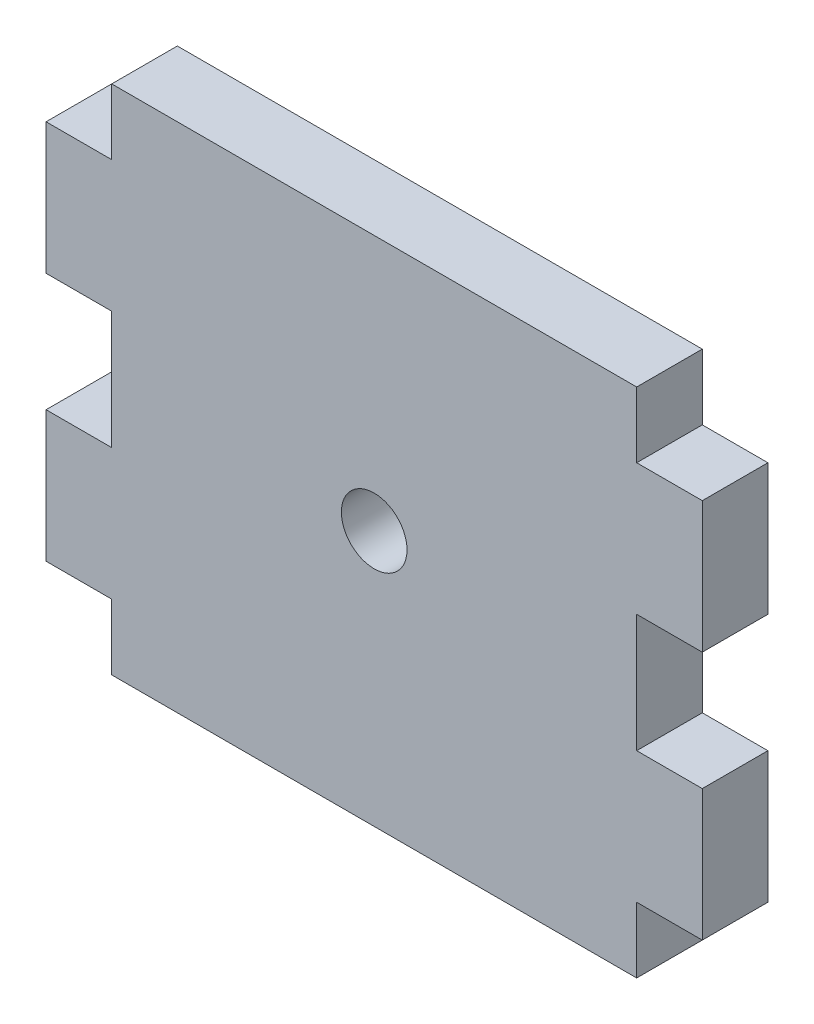
ISO-10303-21;
HEADER;
FILE_DESCRIPTION(('STEP AP214'),'2;1');
FILE_NAME('part.step','',(''),(''),'','','');
FILE_SCHEMA(('AUTOMOTIVE_DESIGN { 1 0 10303 214 1 1 1 1 }'));
ENDSEC;
DATA;
#1=APPLICATION_CONTEXT('core data for automotive mechanical design processes');
#2=APPLICATION_PROTOCOL_DEFINITION('international standard','automotive_design',2000,#1);
#3=PRODUCT_CONTEXT('',#1,'mechanical');
#4=PRODUCT('Part','Part','',(#3));
#5=PRODUCT_RELATED_PRODUCT_CATEGORY('part','',(#4));
#6=PRODUCT_DEFINITION_FORMATION('','',#4);
#7=PRODUCT_DEFINITION_CONTEXT('part definition',#1,'design');
#8=PRODUCT_DEFINITION('design','',#6,#7);
#9=PRODUCT_DEFINITION_SHAPE('','',#8);
#10=(LENGTH_UNIT() NAMED_UNIT(*) SI_UNIT(.MILLI.,.METRE.));
#11=(NAMED_UNIT(*) PLANE_ANGLE_UNIT() SI_UNIT($,.RADIAN.));
#12=(NAMED_UNIT(*) SI_UNIT($,.STERADIAN.) SOLID_ANGLE_UNIT());
#13=UNCERTAINTY_MEASURE_WITH_UNIT(LENGTH_MEASURE(1.E-05),#10,'distance_accuracy_value','');
#14=(GEOMETRIC_REPRESENTATION_CONTEXT(3) GLOBAL_UNCERTAINTY_ASSIGNED_CONTEXT((#13)) GLOBAL_UNIT_ASSIGNED_CONTEXT((#10,
#11,#12)) REPRESENTATION_CONTEXT('',''));
#15=CARTESIAN_POINT('',(0.,0.,0.));
#16=DIRECTION('',(0.,0.,1.));
#17=DIRECTION('',(1.,0.,0.));
#18=AXIS2_PLACEMENT_3D('',#15,#16,#17);
#19=CARTESIAN_POINT('',(0.,0.,5.));
#20=DIRECTION('',(0.,0.,1.));
#21=DIRECTION('',(1.,0.,0.));
#22=AXIS2_PLACEMENT_3D('',#19,#20,#21);
#23=PLANE('',#22);
#24=DIRECTION('',(0.,1.,0.));
#25=VECTOR('',#24,1.);
#26=CARTESIAN_POINT('',(25.,4.5,5.));
#27=LINE('',#26,#25);
#28=CARTESIAN_POINT('',(25.,4.5,5.));
#29=VERTEX_POINT('',#28);
#30=CARTESIAN_POINT('',(25.,14.5,5.));
#31=VERTEX_POINT('',#30);
#32=EDGE_CURVE('E241',#29,#31,#27,.T.);
#33=ORIENTED_EDGE('',*,*,#32,.T.);
#34=DIRECTION('',(-1.,0.,0.));
#35=VECTOR('',#34,1.);
#36=CARTESIAN_POINT('',(25.,14.5,5.));
#37=LINE('',#36,#35);
#38=CARTESIAN_POINT('',(20.,14.5,5.));
#39=VERTEX_POINT('',#38);
#40=EDGE_CURVE('E129',#31,#39,#37,.T.);
#41=ORIENTED_EDGE('',*,*,#40,.T.);
#42=DIRECTION('',(0.,1.,0.));
#43=VECTOR('',#42,1.);
#44=CARTESIAN_POINT('',(20.,14.5,5.));
#45=LINE('',#44,#43);
#46=CARTESIAN_POINT('',(20.,19.5,5.));
#47=VERTEX_POINT('',#46);
#48=EDGE_CURVE('E292',#39,#47,#45,.T.);
#49=ORIENTED_EDGE('',*,*,#48,.T.);
#50=DIRECTION('',(-1.,0.,0.));
#51=VECTOR('',#50,1.);
#52=CARTESIAN_POINT('',(-20.,19.5,5.));
#53=LINE('',#52,#51);
#54=CARTESIAN_POINT('',(-20.,19.5,5.));
#55=VERTEX_POINT('',#54);
#56=EDGE_CURVE('E311',#47,#55,#53,.T.);
#57=ORIENTED_EDGE('',*,*,#56,.T.);
#58=DIRECTION('',(0.,-1.,0.));
#59=VECTOR('',#58,1.);
#60=CARTESIAN_POINT('',(-20.,14.5,5.));
#61=LINE('',#60,#59);
#62=CARTESIAN_POINT('',(-20.,14.5,5.));
#63=VERTEX_POINT('',#62);
#64=EDGE_CURVE('E308',#55,#63,#61,.T.);
#65=ORIENTED_EDGE('',*,*,#64,.T.);
#66=DIRECTION('',(-1.,0.,0.));
#67=VECTOR('',#66,1.);
#68=CARTESIAN_POINT('',(-25.,14.5,5.));
#69=LINE('',#68,#67);
#70=CARTESIAN_POINT('',(-25.,14.5,5.));
#71=VERTEX_POINT('',#70);
#72=EDGE_CURVE('E310',#63,#71,#69,.T.);
#73=ORIENTED_EDGE('',*,*,#72,.T.);
#74=DIRECTION('',(0.,-1.,0.));
#75=VECTOR('',#74,1.);
#76=CARTESIAN_POINT('',(-25.,4.5,5.));
#77=LINE('',#76,#75);
#78=CARTESIAN_POINT('',(-25.,4.5,5.));
#79=VERTEX_POINT('',#78);
#80=EDGE_CURVE('E313',#71,#79,#77,.T.);
#81=ORIENTED_EDGE('',*,*,#80,.T.);
#82=DIRECTION('',(1.,0.,0.));
#83=VECTOR('',#82,1.);
#84=CARTESIAN_POINT('',(-20.,4.5,5.));
#85=LINE('',#84,#83);
#86=CARTESIAN_POINT('',(-20.,4.5,5.));
#87=VERTEX_POINT('',#86);
#88=EDGE_CURVE('E319',#79,#87,#85,.T.);
#89=ORIENTED_EDGE('',*,*,#88,.T.);
#90=DIRECTION('',(0.,-1.,0.));
#91=VECTOR('',#90,1.);
#92=CARTESIAN_POINT('',(-20.,4.5,5.));
#93=LINE('',#92,#91);
#94=CARTESIAN_POINT('',(-20.,-4.5,5.));
#95=VERTEX_POINT('',#94);
#96=EDGE_CURVE('E321',#87,#95,#93,.T.);
#97=ORIENTED_EDGE('',*,*,#96,.T.);
#98=DIRECTION('',(-1.,0.,0.));
#99=VECTOR('',#98,1.);
#100=CARTESIAN_POINT('',(-20.,-4.5,5.));
#101=LINE('',#100,#99);
#102=CARTESIAN_POINT('',(-25.,-4.5,5.));
#103=VERTEX_POINT('',#102);
#104=EDGE_CURVE('E323',#95,#103,#101,.T.);
#105=ORIENTED_EDGE('',*,*,#104,.T.);
#106=DIRECTION('',(0.,-1.,0.));
#107=VECTOR('',#106,1.);
#108=CARTESIAN_POINT('',(-25.,-14.5,5.));
#109=LINE('',#108,#107);
#110=CARTESIAN_POINT('',(-25.,-14.5,5.));
#111=VERTEX_POINT('',#110);
#112=EDGE_CURVE('E325',#103,#111,#109,.T.);
#113=ORIENTED_EDGE('',*,*,#112,.T.);
#114=DIRECTION('',(1.,0.,0.));
#115=VECTOR('',#114,1.);
#116=CARTESIAN_POINT('',(-25.,-14.5,5.));
#117=LINE('',#116,#115);
#118=CARTESIAN_POINT('',(-20.,-14.5,5.));
#119=VERTEX_POINT('',#118);
#120=EDGE_CURVE('E327',#111,#119,#117,.T.);
#121=ORIENTED_EDGE('',*,*,#120,.T.);
#122=DIRECTION('',(0.,-1.,0.));
#123=VECTOR('',#122,1.);
#124=CARTESIAN_POINT('',(-20.,-14.5,5.));
#125=LINE('',#124,#123);
#126=CARTESIAN_POINT('',(-20.,-19.5,5.));
#127=VERTEX_POINT('',#126);
#128=EDGE_CURVE('E329',#119,#127,#125,.T.);
#129=ORIENTED_EDGE('',*,*,#128,.T.);
#130=DIRECTION('',(1.,0.,0.));
#131=VECTOR('',#130,1.);
#132=CARTESIAN_POINT('',(-20.,-19.5,5.));
#133=LINE('',#132,#131);
#134=CARTESIAN_POINT('',(20.,-19.5,5.));
#135=VERTEX_POINT('',#134);
#136=EDGE_CURVE('E331',#127,#135,#133,.T.);
#137=ORIENTED_EDGE('',*,*,#136,.T.);
#138=DIRECTION('',(0.,1.,0.));
#139=VECTOR('',#138,1.);
#140=CARTESIAN_POINT('',(20.,-14.5,5.));
#141=LINE('',#140,#139);
#142=CARTESIAN_POINT('',(20.,-14.5,5.));
#143=VERTEX_POINT('',#142);
#144=EDGE_CURVE('E333',#135,#143,#141,.T.);
#145=ORIENTED_EDGE('',*,*,#144,.T.);
#146=DIRECTION('',(1.,0.,0.));
#147=VECTOR('',#146,1.);
#148=CARTESIAN_POINT('',(20.,-14.5,5.));
#149=LINE('',#148,#147);
#150=CARTESIAN_POINT('',(25.,-14.5,5.));
#151=VERTEX_POINT('',#150);
#152=EDGE_CURVE('E335',#143,#151,#149,.T.);
#153=ORIENTED_EDGE('',*,*,#152,.T.);
#154=DIRECTION('',(0.,1.,0.));
#155=VECTOR('',#154,1.);
#156=CARTESIAN_POINT('',(25.,-14.5,5.));
#157=LINE('',#156,#155);
#158=CARTESIAN_POINT('',(25.,-4.5,5.));
#159=VERTEX_POINT('',#158);
#160=EDGE_CURVE('E184',#151,#159,#157,.T.);
#161=ORIENTED_EDGE('',*,*,#160,.T.);
#162=DIRECTION('',(-1.,0.,0.));
#163=VECTOR('',#162,1.);
#164=CARTESIAN_POINT('',(25.,-4.5,5.));
#165=LINE('',#164,#163);
#166=CARTESIAN_POINT('',(20.,-4.5,5.));
#167=VERTEX_POINT('',#166);
#168=EDGE_CURVE('E178',#159,#167,#165,.T.);
#169=ORIENTED_EDGE('',*,*,#168,.T.);
#170=DIRECTION('',(0.,1.,0.));
#171=VECTOR('',#170,1.);
#172=CARTESIAN_POINT('',(20.,4.5,5.));
#173=LINE('',#172,#171);
#174=CARTESIAN_POINT('',(20.,4.5,5.));
#175=VERTEX_POINT('',#174);
#176=EDGE_CURVE('E182',#167,#175,#173,.T.);
#177=ORIENTED_EDGE('',*,*,#176,.T.);
#178=DIRECTION('',(1.,0.,0.));
#179=VECTOR('',#178,1.);
#180=CARTESIAN_POINT('',(20.,4.5,5.));
#181=LINE('',#180,#179);
#182=EDGE_CURVE('E50',#175,#29,#181,.T.);
#183=ORIENTED_EDGE('',*,*,#182,.T.);
#184=EDGE_LOOP('',(#33,#41,#49,#57,#65,#73,#81,#89,#97,#105,#113,#121,#129,#137,#145,#153,#161,
#169,#177,#183));
#185=FACE_BOUND('',#184,.T.);
#186=CARTESIAN_POINT('',(0.,0.,5.));
#187=DIRECTION('',(0.,0.,1.));
#188=DIRECTION('',(1.,0.,0.));
#189=AXIS2_PLACEMENT_3D('',#186,#187,#188);
#190=CIRCLE('',#189,2.5);
#191=CARTESIAN_POINT('',(2.5,0.,5.));
#192=VERTEX_POINT('',#191);
#193=EDGE_CURVE('E206',#192,#192,#190,.T.);
#194=ORIENTED_EDGE('',*,*,#193,.F.);
#195=EDGE_LOOP('',(#194));
#196=FACE_BOUND('',#195,.T.);
#197=ADVANCED_FACE('F33',(#185,#196),#23,.T.);
#198=CARTESIAN_POINT('',(0.,0.,0.));
#199=DIRECTION('',(0.,0.,1.));
#200=DIRECTION('',(1.,0.,0.));
#201=AXIS2_PLACEMENT_3D('',#198,#199,#200);
#202=PLANE('',#201);
#203=DIRECTION('',(0.,1.,0.));
#204=VECTOR('',#203,1.);
#205=CARTESIAN_POINT('',(25.,4.5,0.));
#206=LINE('',#205,#204);
#207=CARTESIAN_POINT('',(25.,4.5,0.));
#208=VERTEX_POINT('',#207);
#209=CARTESIAN_POINT('',(25.,14.5,0.));
#210=VERTEX_POINT('',#209);
#211=EDGE_CURVE('E202',#208,#210,#206,.T.);
#212=ORIENTED_EDGE('',*,*,#211,.F.);
#213=DIRECTION('',(1.,0.,0.));
#214=VECTOR('',#213,1.);
#215=CARTESIAN_POINT('',(20.,4.5,0.));
#216=LINE('',#215,#214);
#217=CARTESIAN_POINT('',(20.,4.5,0.));
#218=VERTEX_POINT('',#217);
#219=EDGE_CURVE('E121',#218,#208,#216,.T.);
#220=ORIENTED_EDGE('',*,*,#219,.F.);
#221=DIRECTION('',(0.,1.,0.));
#222=VECTOR('',#221,1.);
#223=CARTESIAN_POINT('',(20.,4.5,0.));
#224=LINE('',#223,#222);
#225=CARTESIAN_POINT('',(20.,-4.5,0.));
#226=VERTEX_POINT('',#225);
#227=EDGE_CURVE('E115',#226,#218,#224,.T.);
#228=ORIENTED_EDGE('',*,*,#227,.F.);
#229=DIRECTION('',(-1.,0.,0.));
#230=VECTOR('',#229,1.);
#231=CARTESIAN_POINT('',(25.,-4.5,0.));
#232=LINE('',#231,#230);
#233=CARTESIAN_POINT('',(25.,-4.5,0.));
#234=VERTEX_POINT('',#233);
#235=EDGE_CURVE('E192',#234,#226,#232,.T.);
#236=ORIENTED_EDGE('',*,*,#235,.F.);
#237=DIRECTION('',(0.,1.,0.));
#238=VECTOR('',#237,1.);
#239=CARTESIAN_POINT('',(25.,-14.5,0.));
#240=LINE('',#239,#238);
#241=CARTESIAN_POINT('',(25.,-14.5,0.));
#242=VERTEX_POINT('',#241);
#243=EDGE_CURVE('E236',#242,#234,#240,.T.);
#244=ORIENTED_EDGE('',*,*,#243,.F.);
#245=DIRECTION('',(1.,0.,0.));
#246=VECTOR('',#245,1.);
#247=CARTESIAN_POINT('',(20.,-14.5,0.));
#248=LINE('',#247,#246);
#249=CARTESIAN_POINT('',(20.,-14.5,0.));
#250=VERTEX_POINT('',#249);
#251=EDGE_CURVE('E234',#250,#242,#248,.T.);
#252=ORIENTED_EDGE('',*,*,#251,.F.);
#253=DIRECTION('',(0.,1.,0.));
#254=VECTOR('',#253,1.);
#255=CARTESIAN_POINT('',(20.,-14.5,0.));
#256=LINE('',#255,#254);
#257=CARTESIAN_POINT('',(20.,-19.5,0.));
#258=VERTEX_POINT('',#257);
#259=EDGE_CURVE('E232',#258,#250,#256,.T.);
#260=ORIENTED_EDGE('',*,*,#259,.F.);
#261=DIRECTION('',(1.,0.,0.));
#262=VECTOR('',#261,1.);
#263=CARTESIAN_POINT('',(-20.,-19.5,0.));
#264=LINE('',#263,#262);
#265=CARTESIAN_POINT('',(-20.,-19.5,0.));
#266=VERTEX_POINT('',#265);
#267=EDGE_CURVE('E230',#266,#258,#264,.T.);
#268=ORIENTED_EDGE('',*,*,#267,.F.);
#269=DIRECTION('',(0.,-1.,0.));
#270=VECTOR('',#269,1.);
#271=CARTESIAN_POINT('',(-20.,-14.5,0.));
#272=LINE('',#271,#270);
#273=CARTESIAN_POINT('',(-20.,-14.5,0.));
#274=VERTEX_POINT('',#273);
#275=EDGE_CURVE('E228',#274,#266,#272,.T.);
#276=ORIENTED_EDGE('',*,*,#275,.F.);
#277=DIRECTION('',(1.,0.,0.));
#278=VECTOR('',#277,1.);
#279=CARTESIAN_POINT('',(-25.,-14.5,0.));
#280=LINE('',#279,#278);
#281=CARTESIAN_POINT('',(-25.,-14.5,0.));
#282=VERTEX_POINT('',#281);
#283=EDGE_CURVE('E226',#282,#274,#280,.T.);
#284=ORIENTED_EDGE('',*,*,#283,.F.);
#285=DIRECTION('',(0.,-1.,0.));
#286=VECTOR('',#285,1.);
#287=CARTESIAN_POINT('',(-25.,-14.5,0.));
#288=LINE('',#287,#286);
#289=CARTESIAN_POINT('',(-25.,-4.5,0.));
#290=VERTEX_POINT('',#289);
#291=EDGE_CURVE('E224',#290,#282,#288,.T.);
#292=ORIENTED_EDGE('',*,*,#291,.F.);
#293=DIRECTION('',(-1.,0.,0.));
#294=VECTOR('',#293,1.);
#295=CARTESIAN_POINT('',(-20.,-4.5,0.));
#296=LINE('',#295,#294);
#297=CARTESIAN_POINT('',(-20.,-4.5,0.));
#298=VERTEX_POINT('',#297);
#299=EDGE_CURVE('E222',#298,#290,#296,.T.);
#300=ORIENTED_EDGE('',*,*,#299,.F.);
#301=DIRECTION('',(0.,-1.,0.));
#302=VECTOR('',#301,1.);
#303=CARTESIAN_POINT('',(-20.,4.5,0.));
#304=LINE('',#303,#302);
#305=CARTESIAN_POINT('',(-20.,4.5,0.));
#306=VERTEX_POINT('',#305);
#307=EDGE_CURVE('E220',#306,#298,#304,.T.);
#308=ORIENTED_EDGE('',*,*,#307,.F.);
#309=DIRECTION('',(1.,0.,0.));
#310=VECTOR('',#309,1.);
#311=CARTESIAN_POINT('',(-20.,4.5,0.));
#312=LINE('',#311,#310);
#313=CARTESIAN_POINT('',(-25.,4.5,0.));
#314=VERTEX_POINT('',#313);
#315=EDGE_CURVE('E218',#314,#306,#312,.T.);
#316=ORIENTED_EDGE('',*,*,#315,.F.);
#317=DIRECTION('',(0.,-1.,0.));
#318=VECTOR('',#317,1.);
#319=CARTESIAN_POINT('',(-25.,4.5,0.));
#320=LINE('',#319,#318);
#321=CARTESIAN_POINT('',(-25.,14.5,0.));
#322=VERTEX_POINT('',#321);
#323=EDGE_CURVE('E216',#322,#314,#320,.T.);
#324=ORIENTED_EDGE('',*,*,#323,.F.);
#325=DIRECTION('',(-1.,0.,0.));
#326=VECTOR('',#325,1.);
#327=CARTESIAN_POINT('',(-25.,14.5,0.));
#328=LINE('',#327,#326);
#329=CARTESIAN_POINT('',(-20.,14.5,0.));
#330=VERTEX_POINT('',#329);
#331=EDGE_CURVE('E214',#330,#322,#328,.T.);
#332=ORIENTED_EDGE('',*,*,#331,.F.);
#333=DIRECTION('',(0.,-1.,0.));
#334=VECTOR('',#333,1.);
#335=CARTESIAN_POINT('',(-20.,14.5,0.));
#336=LINE('',#335,#334);
#337=CARTESIAN_POINT('',(-20.,19.5,0.));
#338=VERTEX_POINT('',#337);
#339=EDGE_CURVE('E212',#338,#330,#336,.T.);
#340=ORIENTED_EDGE('',*,*,#339,.F.);
#341=DIRECTION('',(-1.,0.,0.));
#342=VECTOR('',#341,1.);
#343=CARTESIAN_POINT('',(-20.,19.5,0.));
#344=LINE('',#343,#342);
#345=CARTESIAN_POINT('',(20.,19.5,0.));
#346=VERTEX_POINT('',#345);
#347=EDGE_CURVE('E210',#346,#338,#344,.T.);
#348=ORIENTED_EDGE('',*,*,#347,.F.);
#349=DIRECTION('',(0.,1.,0.));
#350=VECTOR('',#349,1.);
#351=CARTESIAN_POINT('',(20.,14.5,0.));
#352=LINE('',#351,#350);
#353=CARTESIAN_POINT('',(20.,14.5,0.));
#354=VERTEX_POINT('',#353);
#355=EDGE_CURVE('E208',#354,#346,#352,.T.);
#356=ORIENTED_EDGE('',*,*,#355,.F.);
#357=DIRECTION('',(-1.,0.,0.));
#358=VECTOR('',#357,1.);
#359=CARTESIAN_POINT('',(25.,14.5,0.));
#360=LINE('',#359,#358);
#361=EDGE_CURVE('E205',#210,#354,#360,.T.);
#362=ORIENTED_EDGE('',*,*,#361,.F.);
#363=EDGE_LOOP('',(#212,#220,#228,#236,#244,#252,#260,#268,#276,#284,#292,#300,#308,#316,#324,
#332,#340,#348,#356,#362));
#364=FACE_BOUND('',#363,.T.);
#365=CARTESIAN_POINT('',(0.,0.,0.));
#366=DIRECTION('',(0.,0.,1.));
#367=DIRECTION('',(1.,0.,0.));
#368=AXIS2_PLACEMENT_3D('',#365,#366,#367);
#369=CIRCLE('',#368,2.5);
#370=CARTESIAN_POINT('',(2.5,0.,0.));
#371=VERTEX_POINT('',#370);
#372=EDGE_CURVE('E586',#371,#371,#369,.T.);
#373=ORIENTED_EDGE('',*,*,#372,.T.);
#374=EDGE_LOOP('',(#373));
#375=FACE_BOUND('',#374,.T.);
#376=ADVANCED_FACE('F296',(#364,#375),#202,.F.);
#377=CARTESIAN_POINT('',(25.,4.5,5.));
#378=DIRECTION('',(-1.,0.,0.));
#379=DIRECTION('',(0.,0.,1.));
#380=AXIS2_PLACEMENT_3D('',#377,#378,#379);
#381=PLANE('',#380);
#382=ORIENTED_EDGE('',*,*,#211,.T.);
#383=DIRECTION('',(0.,0.,-1.));
#384=VECTOR('',#383,1.);
#385=CARTESIAN_POINT('',(25.,14.5,5.));
#386=LINE('',#385,#384);
#387=EDGE_CURVE('E11',#31,#210,#386,.T.);
#388=ORIENTED_EDGE('',*,*,#387,.F.);
#389=ORIENTED_EDGE('',*,*,#32,.F.);
#390=DIRECTION('',(0.,0.,-1.));
#391=VECTOR('',#390,1.);
#392=CARTESIAN_POINT('',(25.,4.5,5.));
#393=LINE('',#392,#391);
#394=EDGE_CURVE('E198',#29,#208,#393,.T.);
#395=ORIENTED_EDGE('',*,*,#394,.T.);
#396=EDGE_LOOP('',(#382,#388,#389,#395));
#397=FACE_BOUND('',#396,.T.);
#398=ADVANCED_FACE('F35',(#397),#381,.F.);
#399=CARTESIAN_POINT('',(25.,14.5,5.));
#400=DIRECTION('',(0.,-1.,0.));
#401=DIRECTION('',(0.,0.,-1.));
#402=AXIS2_PLACEMENT_3D('',#399,#400,#401);
#403=PLANE('',#402);
#404=ORIENTED_EDGE('',*,*,#361,.T.);
#405=DIRECTION('',(0.,0.,-1.));
#406=VECTOR('',#405,1.);
#407=CARTESIAN_POINT('',(20.,14.5,5.));
#408=LINE('',#407,#406);
#409=EDGE_CURVE('E42',#39,#354,#408,.T.);
#410=ORIENTED_EDGE('',*,*,#409,.F.);
#411=ORIENTED_EDGE('',*,*,#40,.F.);
#412=ORIENTED_EDGE('',*,*,#387,.T.);
#413=EDGE_LOOP('',(#404,#410,#411,#412));
#414=FACE_BOUND('',#413,.T.);
#415=ADVANCED_FACE('F369',(#414),#403,.F.);
#416=CARTESIAN_POINT('',(20.,14.5,5.));
#417=DIRECTION('',(-1.,0.,0.));
#418=DIRECTION('',(0.,-1.,0.));
#419=AXIS2_PLACEMENT_3D('',#416,#417,#418);
#420=PLANE('',#419);
#421=ORIENTED_EDGE('',*,*,#355,.T.);
#422=DIRECTION('',(0.,0.,-1.));
#423=VECTOR('',#422,1.);
#424=CARTESIAN_POINT('',(20.,19.5,5.));
#425=LINE('',#424,#423);
#426=EDGE_CURVE('E284',#47,#346,#425,.T.);
#427=ORIENTED_EDGE('',*,*,#426,.F.);
#428=ORIENTED_EDGE('',*,*,#48,.F.);
#429=ORIENTED_EDGE('',*,*,#409,.T.);
#430=EDGE_LOOP('',(#421,#427,#428,#429));
#431=FACE_BOUND('',#430,.T.);
#432=ADVANCED_FACE('F290',(#431),#420,.F.);
#433=CARTESIAN_POINT('',(-20.,19.5,5.));
#434=DIRECTION('',(0.,-1.,0.));
#435=DIRECTION('',(0.,0.,-1.));
#436=AXIS2_PLACEMENT_3D('',#433,#434,#435);
#437=PLANE('',#436);
#438=ORIENTED_EDGE('',*,*,#347,.T.);
#439=DIRECTION('',(0.,0.,-1.));
#440=VECTOR('',#439,1.);
#441=CARTESIAN_POINT('',(-20.,19.5,5.));
#442=LINE('',#441,#440);
#443=EDGE_CURVE('E281',#55,#338,#442,.T.);
#444=ORIENTED_EDGE('',*,*,#443,.F.);
#445=ORIENTED_EDGE('',*,*,#56,.F.);
#446=ORIENTED_EDGE('',*,*,#426,.T.);
#447=EDGE_LOOP('',(#438,#444,#445,#446));
#448=FACE_BOUND('',#447,.T.);
#449=ADVANCED_FACE('F302',(#448),#437,.F.);
#450=CARTESIAN_POINT('',(-20.,14.5,5.));
#451=DIRECTION('',(1.,0.,0.));
#452=DIRECTION('',(0.,0.,-1.));
#453=AXIS2_PLACEMENT_3D('',#450,#451,#452);
#454=PLANE('',#453);
#455=ORIENTED_EDGE('',*,*,#339,.T.);
#456=DIRECTION('',(0.,0.,-1.));
#457=VECTOR('',#456,1.);
#458=CARTESIAN_POINT('',(-20.,14.5,5.));
#459=LINE('',#458,#457);
#460=EDGE_CURVE('E278',#63,#330,#459,.T.);
#461=ORIENTED_EDGE('',*,*,#460,.F.);
#462=ORIENTED_EDGE('',*,*,#64,.F.);
#463=ORIENTED_EDGE('',*,*,#443,.T.);
#464=EDGE_LOOP('',(#455,#461,#462,#463));
#465=FACE_BOUND('',#464,.T.);
#466=ADVANCED_FACE('F306',(#465),#454,.F.);
#467=CARTESIAN_POINT('',(-25.,14.5,5.));
#468=DIRECTION('',(0.,-1.,0.));
#469=DIRECTION('',(0.,0.,-1.));
#470=AXIS2_PLACEMENT_3D('',#467,#468,#469);
#471=PLANE('',#470);
#472=ORIENTED_EDGE('',*,*,#331,.T.);
#473=DIRECTION('',(0.,0.,-1.));
#474=VECTOR('',#473,1.);
#475=CARTESIAN_POINT('',(-25.,14.5,5.));
#476=LINE('',#475,#474);
#477=EDGE_CURVE('E275',#71,#322,#476,.T.);
#478=ORIENTED_EDGE('',*,*,#477,.F.);
#479=ORIENTED_EDGE('',*,*,#72,.F.);
#480=ORIENTED_EDGE('',*,*,#460,.T.);
#481=EDGE_LOOP('',(#472,#478,#479,#480));
#482=FACE_BOUND('',#481,.T.);
#483=ADVANCED_FACE('F382',(#482),#471,.F.);
#484=CARTESIAN_POINT('',(-25.,4.5,5.));
#485=DIRECTION('',(1.,0.,0.));
#486=DIRECTION('',(0.,0.,-1.));
#487=AXIS2_PLACEMENT_3D('',#484,#485,#486);
#488=PLANE('',#487);
#489=ORIENTED_EDGE('',*,*,#323,.T.);
#490=DIRECTION('',(0.,0.,-1.));
#491=VECTOR('',#490,1.);
#492=CARTESIAN_POINT('',(-25.,4.5,5.));
#493=LINE('',#492,#491);
#494=EDGE_CURVE('E272',#79,#314,#493,.T.);
#495=ORIENTED_EDGE('',*,*,#494,.F.);
#496=ORIENTED_EDGE('',*,*,#80,.F.);
#497=ORIENTED_EDGE('',*,*,#477,.T.);
#498=EDGE_LOOP('',(#489,#495,#496,#497));
#499=FACE_BOUND('',#498,.T.);
#500=ADVANCED_FACE('F385',(#499),#488,.F.);
#501=CARTESIAN_POINT('',(-20.,4.5,5.));
#502=DIRECTION('',(0.,1.,0.));
#503=DIRECTION('',(-1.,0.,0.));
#504=AXIS2_PLACEMENT_3D('',#501,#502,#503);
#505=PLANE('',#504);
#506=ORIENTED_EDGE('',*,*,#315,.T.);
#507=DIRECTION('',(0.,0.,-1.));
#508=VECTOR('',#507,1.);
#509=CARTESIAN_POINT('',(-20.,4.5,5.));
#510=LINE('',#509,#508);
#511=EDGE_CURVE('E269',#87,#306,#510,.T.);
#512=ORIENTED_EDGE('',*,*,#511,.F.);
#513=ORIENTED_EDGE('',*,*,#88,.F.);
#514=ORIENTED_EDGE('',*,*,#494,.T.);
#515=EDGE_LOOP('',(#506,#512,#513,#514));
#516=FACE_BOUND('',#515,.T.);
#517=ADVANCED_FACE('F389',(#516),#505,.F.);
#518=CARTESIAN_POINT('',(-20.,4.5,5.));
#519=DIRECTION('',(1.,0.,0.));
#520=DIRECTION('',(0.,1.,0.));
#521=AXIS2_PLACEMENT_3D('',#518,#519,#520);
#522=PLANE('',#521);
#523=ORIENTED_EDGE('',*,*,#307,.T.);
#524=DIRECTION('',(0.,0.,-1.));
#525=VECTOR('',#524,1.);
#526=CARTESIAN_POINT('',(-20.,-4.5,5.));
#527=LINE('',#526,#525);
#528=EDGE_CURVE('E266',#95,#298,#527,.T.);
#529=ORIENTED_EDGE('',*,*,#528,.F.);
#530=ORIENTED_EDGE('',*,*,#96,.F.);
#531=ORIENTED_EDGE('',*,*,#511,.T.);
#532=EDGE_LOOP('',(#523,#529,#530,#531));
#533=FACE_BOUND('',#532,.T.);
#534=ADVANCED_FACE('F393',(#533),#522,.F.);
#535=CARTESIAN_POINT('',(-20.,-4.5,5.));
#536=DIRECTION('',(0.,-1.,0.));
#537=DIRECTION('',(1.,0.,0.));
#538=AXIS2_PLACEMENT_3D('',#535,#536,#537);
#539=PLANE('',#538);
#540=ORIENTED_EDGE('',*,*,#299,.T.);
#541=DIRECTION('',(0.,0.,-1.));
#542=VECTOR('',#541,1.);
#543=CARTESIAN_POINT('',(-25.,-4.5,5.));
#544=LINE('',#543,#542);
#545=EDGE_CURVE('E263',#103,#290,#544,.T.);
#546=ORIENTED_EDGE('',*,*,#545,.F.);
#547=ORIENTED_EDGE('',*,*,#104,.F.);
#548=ORIENTED_EDGE('',*,*,#528,.T.);
#549=EDGE_LOOP('',(#540,#546,#547,#548));
#550=FACE_BOUND('',#549,.T.);
#551=ADVANCED_FACE('F397',(#550),#539,.F.);
#552=CARTESIAN_POINT('',(-25.,-14.5,5.));
#553=DIRECTION('',(1.,0.,0.));
#554=DIRECTION('',(0.,0.,-1.));
#555=AXIS2_PLACEMENT_3D('',#552,#553,#554);
#556=PLANE('',#555);
#557=ORIENTED_EDGE('',*,*,#291,.T.);
#558=DIRECTION('',(0.,0.,-1.));
#559=VECTOR('',#558,1.);
#560=CARTESIAN_POINT('',(-25.,-14.5,5.));
#561=LINE('',#560,#559);
#562=EDGE_CURVE('E260',#111,#282,#561,.T.);
#563=ORIENTED_EDGE('',*,*,#562,.F.);
#564=ORIENTED_EDGE('',*,*,#112,.F.);
#565=ORIENTED_EDGE('',*,*,#545,.T.);
#566=EDGE_LOOP('',(#557,#563,#564,#565));
#567=FACE_BOUND('',#566,.T.);
#568=ADVANCED_FACE('F401',(#567),#556,.F.);
#569=CARTESIAN_POINT('',(-25.,-14.5,5.));
#570=DIRECTION('',(0.,1.,0.));
#571=DIRECTION('',(0.,0.,1.));
#572=AXIS2_PLACEMENT_3D('',#569,#570,#571);
#573=PLANE('',#572);
#574=ORIENTED_EDGE('',*,*,#283,.T.);
#575=DIRECTION('',(0.,0.,-1.));
#576=VECTOR('',#575,1.);
#577=CARTESIAN_POINT('',(-20.,-14.5,5.));
#578=LINE('',#577,#576);
#579=EDGE_CURVE('E257',#119,#274,#578,.T.);
#580=ORIENTED_EDGE('',*,*,#579,.F.);
#581=ORIENTED_EDGE('',*,*,#120,.F.);
#582=ORIENTED_EDGE('',*,*,#562,.T.);
#583=EDGE_LOOP('',(#574,#580,#581,#582));
#584=FACE_BOUND('',#583,.T.);
#585=ADVANCED_FACE('F405',(#584),#573,.F.);
#586=CARTESIAN_POINT('',(-20.,-14.5,5.));
#587=DIRECTION('',(1.,0.,0.));
#588=DIRECTION('',(0.,0.,-1.));
#589=AXIS2_PLACEMENT_3D('',#586,#587,#588);
#590=PLANE('',#589);
#591=ORIENTED_EDGE('',*,*,#275,.T.);
#592=DIRECTION('',(0.,0.,-1.));
#593=VECTOR('',#592,1.);
#594=CARTESIAN_POINT('',(-20.,-19.5,5.));
#595=LINE('',#594,#593);
#596=EDGE_CURVE('E254',#127,#266,#595,.T.);
#597=ORIENTED_EDGE('',*,*,#596,.F.);
#598=ORIENTED_EDGE('',*,*,#128,.F.);
#599=ORIENTED_EDGE('',*,*,#579,.T.);
#600=EDGE_LOOP('',(#591,#597,#598,#599));
#601=FACE_BOUND('',#600,.T.);
#602=ADVANCED_FACE('F409',(#601),#590,.F.);
#603=CARTESIAN_POINT('',(-20.,-19.5,5.));
#604=DIRECTION('',(0.,1.,0.));
#605=DIRECTION('',(-1.,0.,0.));
#606=AXIS2_PLACEMENT_3D('',#603,#604,#605);
#607=PLANE('',#606);
#608=ORIENTED_EDGE('',*,*,#267,.T.);
#609=DIRECTION('',(0.,0.,-1.));
#610=VECTOR('',#609,1.);
#611=CARTESIAN_POINT('',(20.,-19.5,5.));
#612=LINE('',#611,#610);
#613=EDGE_CURVE('E251',#135,#258,#612,.T.);
#614=ORIENTED_EDGE('',*,*,#613,.F.);
#615=ORIENTED_EDGE('',*,*,#136,.F.);
#616=ORIENTED_EDGE('',*,*,#596,.T.);
#617=EDGE_LOOP('',(#608,#614,#615,#616));
#618=FACE_BOUND('',#617,.T.);
#619=ADVANCED_FACE('F413',(#618),#607,.F.);
#620=CARTESIAN_POINT('',(20.,-14.5,5.));
#621=DIRECTION('',(-1.,0.,0.));
#622=DIRECTION('',(0.,-1.,0.));
#623=AXIS2_PLACEMENT_3D('',#620,#621,#622);
#624=PLANE('',#623);
#625=ORIENTED_EDGE('',*,*,#259,.T.);
#626=DIRECTION('',(0.,0.,-1.));
#627=VECTOR('',#626,1.);
#628=CARTESIAN_POINT('',(20.,-14.5,5.));
#629=LINE('',#628,#627);
#630=EDGE_CURVE('E248',#143,#250,#629,.T.);
#631=ORIENTED_EDGE('',*,*,#630,.F.);
#632=ORIENTED_EDGE('',*,*,#144,.F.);
#633=ORIENTED_EDGE('',*,*,#613,.T.);
#634=EDGE_LOOP('',(#625,#631,#632,#633));
#635=FACE_BOUND('',#634,.T.);
#636=ADVANCED_FACE('F417',(#635),#624,.F.);
#637=CARTESIAN_POINT('',(20.,-14.5,5.));
#638=DIRECTION('',(0.,1.,0.));
#639=DIRECTION('',(0.,0.,1.));
#640=AXIS2_PLACEMENT_3D('',#637,#638,#639);
#641=PLANE('',#640);
#642=ORIENTED_EDGE('',*,*,#251,.T.);
#643=DIRECTION('',(0.,0.,-1.));
#644=VECTOR('',#643,1.);
#645=CARTESIAN_POINT('',(25.,-14.5,5.));
#646=LINE('',#645,#644);
#647=EDGE_CURVE('E245',#151,#242,#646,.T.);
#648=ORIENTED_EDGE('',*,*,#647,.F.);
#649=ORIENTED_EDGE('',*,*,#152,.F.);
#650=ORIENTED_EDGE('',*,*,#630,.T.);
#651=EDGE_LOOP('',(#642,#648,#649,#650));
#652=FACE_BOUND('',#651,.T.);
#653=ADVANCED_FACE('F341',(#652),#641,.F.);
#654=CARTESIAN_POINT('',(25.,-14.5,5.));
#655=DIRECTION('',(-1.,0.,0.));
#656=DIRECTION('',(0.,0.,1.));
#657=AXIS2_PLACEMENT_3D('',#654,#655,#656);
#658=PLANE('',#657);
#659=ORIENTED_EDGE('',*,*,#243,.T.);
#660=DIRECTION('',(0.,0.,-1.));
#661=VECTOR('',#660,1.);
#662=CARTESIAN_POINT('',(25.,-4.5,5.));
#663=LINE('',#662,#661);
#664=EDGE_CURVE('E193',#159,#234,#663,.T.);
#665=ORIENTED_EDGE('',*,*,#664,.F.);
#666=ORIENTED_EDGE('',*,*,#160,.F.);
#667=ORIENTED_EDGE('',*,*,#647,.T.);
#668=EDGE_LOOP('',(#659,#665,#666,#667));
#669=FACE_BOUND('',#668,.T.);
#670=ADVANCED_FACE('F345',(#669),#658,.F.);
#671=CARTESIAN_POINT('',(25.,-4.5,5.));
#672=DIRECTION('',(0.,-1.,0.));
#673=DIRECTION('',(0.,0.,-1.));
#674=AXIS2_PLACEMENT_3D('',#671,#672,#673);
#675=PLANE('',#674);
#676=ORIENTED_EDGE('',*,*,#235,.T.);
#677=DIRECTION('',(0.,0.,-1.));
#678=VECTOR('',#677,1.);
#679=CARTESIAN_POINT('',(20.,-4.5,5.));
#680=LINE('',#679,#678);
#681=EDGE_CURVE('E189',#167,#226,#680,.T.);
#682=ORIENTED_EDGE('',*,*,#681,.F.);
#683=ORIENTED_EDGE('',*,*,#168,.F.);
#684=ORIENTED_EDGE('',*,*,#664,.T.);
#685=EDGE_LOOP('',(#676,#682,#683,#684));
#686=FACE_BOUND('',#685,.T.);
#687=ADVANCED_FACE('F190',(#686),#675,.F.);
#688=CARTESIAN_POINT('',(20.,4.5,5.));
#689=DIRECTION('',(-1.,0.,0.));
#690=DIRECTION('',(0.,0.,1.));
#691=AXIS2_PLACEMENT_3D('',#688,#689,#690);
#692=PLANE('',#691);
#693=ORIENTED_EDGE('',*,*,#227,.T.);
#694=DIRECTION('',(0.,0.,-1.));
#695=VECTOR('',#694,1.);
#696=CARTESIAN_POINT('',(20.,4.5,5.));
#697=LINE('',#696,#695);
#698=EDGE_CURVE('E194',#175,#218,#697,.T.);
#699=ORIENTED_EDGE('',*,*,#698,.F.);
#700=ORIENTED_EDGE('',*,*,#176,.F.);
#701=ORIENTED_EDGE('',*,*,#681,.T.);
#702=EDGE_LOOP('',(#693,#699,#700,#701));
#703=FACE_BOUND('',#702,.T.);
#704=ADVANCED_FACE('F196',(#703),#692,.F.);
#705=CARTESIAN_POINT('',(20.,4.5,5.));
#706=DIRECTION('',(0.,1.,0.));
#707=DIRECTION('',(-1.,0.,0.));
#708=AXIS2_PLACEMENT_3D('',#705,#706,#707);
#709=PLANE('',#708);
#710=ORIENTED_EDGE('',*,*,#219,.T.);
#711=ORIENTED_EDGE('',*,*,#394,.F.);
#712=ORIENTED_EDGE('',*,*,#182,.F.);
#713=ORIENTED_EDGE('',*,*,#698,.T.);
#714=EDGE_LOOP('',(#710,#711,#712,#713));
#715=FACE_BOUND('',#714,.T.);
#716=ADVANCED_FACE('F349',(#715),#709,.F.);
#717=CARTESIAN_POINT('',(0.,0.,5.));
#718=DIRECTION('',(0.,0.,-1.));
#719=DIRECTION('',(-1.,0.,0.));
#720=AXIS2_PLACEMENT_3D('',#717,#718,#719);
#721=CYLINDRICAL_SURFACE('',#720,2.5);
#722=ORIENTED_EDGE('',*,*,#193,.T.);
#723=EDGE_LOOP('',(#722));
#724=FACE_BOUND('',#723,.T.);
#725=ORIENTED_EDGE('',*,*,#372,.F.);
#726=EDGE_LOOP('',(#725));
#727=FACE_BOUND('',#726,.T.);
#728=ADVANCED_FACE('F351',(#724,#727),#721,.F.);
#729=CLOSED_SHELL('',(#197,#376,#398,#415,#432,#449,#466,#483,#500,#517,#534,#551,#568,#585,
#602,#619,#636,#653,#670,#687,#704,#716,#728));
#730=MANIFOLD_SOLID_BREP('B2',#729);
#731=ADVANCED_BREP_SHAPE_REPRESENTATION('',(#18,#730),#14);
#732=SHAPE_DEFINITION_REPRESENTATION(#9,#731);
ENDSEC;
END-ISO-10303-21;
